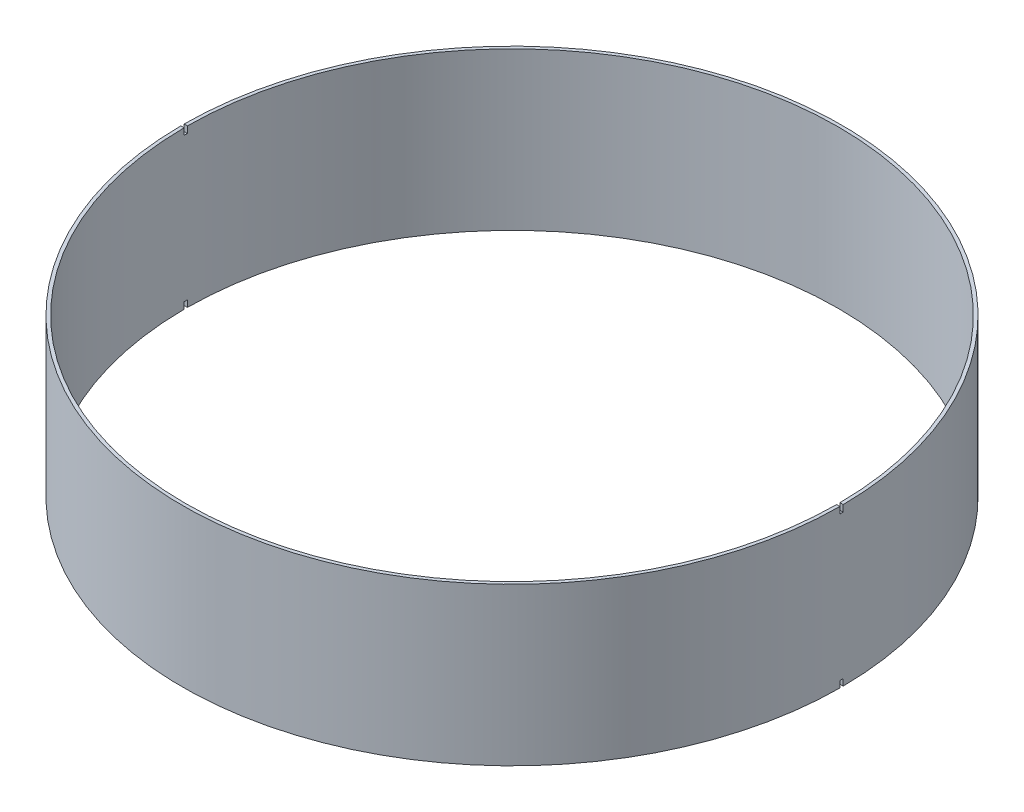
ISO-10303-21;
HEADER;
FILE_DESCRIPTION(('STEP AP214'),'2;1');
FILE_NAME('part.step','',(''),(''),'','','');
FILE_SCHEMA(('AUTOMOTIVE_DESIGN { 1 0 10303 214 1 1 1 1 }'));
ENDSEC;
DATA;
#1=APPLICATION_CONTEXT('core data for automotive mechanical design processes');
#2=APPLICATION_PROTOCOL_DEFINITION('international standard','automotive_design',2000,#1);
#3=PRODUCT_CONTEXT('',#1,'mechanical');
#4=PRODUCT('Part','Part','',(#3));
#5=PRODUCT_RELATED_PRODUCT_CATEGORY('part','',(#4));
#6=PRODUCT_DEFINITION_FORMATION('','',#4);
#7=PRODUCT_DEFINITION_CONTEXT('part definition',#1,'design');
#8=PRODUCT_DEFINITION('design','',#6,#7);
#9=PRODUCT_DEFINITION_SHAPE('','',#8);
#10=(LENGTH_UNIT() NAMED_UNIT(*) SI_UNIT(.MILLI.,.METRE.));
#11=(NAMED_UNIT(*) PLANE_ANGLE_UNIT() SI_UNIT($,.RADIAN.));
#12=(NAMED_UNIT(*) SI_UNIT($,.STERADIAN.) SOLID_ANGLE_UNIT());
#13=UNCERTAINTY_MEASURE_WITH_UNIT(LENGTH_MEASURE(1.E-05),#10,'distance_accuracy_value','');
#14=(GEOMETRIC_REPRESENTATION_CONTEXT(3) GLOBAL_UNCERTAINTY_ASSIGNED_CONTEXT((#13)) GLOBAL_UNIT_ASSIGNED_CONTEXT((#10,
#11,#12)) REPRESENTATION_CONTEXT('',''));
#15=CARTESIAN_POINT('',(0.,0.,0.));
#16=DIRECTION('',(0.,0.,1.));
#17=DIRECTION('',(1.,0.,0.));
#18=AXIS2_PLACEMENT_3D('',#15,#16,#17);
#19=CARTESIAN_POINT('',(0.,24.,0.));
#20=DIRECTION('',(0.,1.,0.));
#21=DIRECTION('',(0.,0.,1.));
#22=AXIS2_PLACEMENT_3D('',#19,#20,#21);
#23=PLANE('',#22);
#24=CARTESIAN_POINT('',(0.,24.,0.));
#25=DIRECTION('',(0.,1.,0.));
#26=DIRECTION('',(0.,0.,1.));
#27=AXIS2_PLACEMENT_3D('',#24,#25,#26);
#28=CIRCLE('',#27,50.3);
#29=CARTESIAN_POINT('',(-50.2993787237974,24.,0.25));
#30=VERTEX_POINT('',#29);
#31=CARTESIAN_POINT('',(50.2993787237974,24.,0.25));
#32=VERTEX_POINT('',#31);
#33=EDGE_CURVE('E177',#30,#32,#28,.T.);
#34=ORIENTED_EDGE('',*,*,#33,.T.);
#35=DIRECTION('',(-1.,0.,0.));
#36=VECTOR('',#35,1.);
#37=CARTESIAN_POINT('',(52.,24.,0.25));
#38=LINE('',#37,#36);
#39=CARTESIAN_POINT('',(49.7993724860063,24.,0.25));
#40=VERTEX_POINT('',#39);
#41=EDGE_CURVE('E234',#32,#40,#38,.T.);
#42=ORIENTED_EDGE('',*,*,#41,.T.);
#43=CARTESIAN_POINT('',(0.,24.,0.));
#44=DIRECTION('',(0.,1.,0.));
#45=DIRECTION('',(0.,0.,1.));
#46=AXIS2_PLACEMENT_3D('',#43,#44,#45);
#47=CIRCLE('',#46,49.8);
#48=CARTESIAN_POINT('',(-49.7993724860063,24.,0.25));
#49=VERTEX_POINT('',#48);
#50=EDGE_CURVE('E179',#49,#40,#47,.T.);
#51=ORIENTED_EDGE('',*,*,#50,.F.);
#52=EDGE_CURVE('E228',#49,#30,#38,.T.);
#53=ORIENTED_EDGE('',*,*,#52,.T.);
#54=EDGE_LOOP('',(#34,#42,#51,#53));
#55=FACE_BOUND('',#54,.T.);
#56=ADVANCED_FACE('F33',(#55),#23,.T.);
#57=CARTESIAN_POINT('',(50.2993787237974,24.,-0.25));
#58=VERTEX_POINT('',#57);
#59=CARTESIAN_POINT('',(-50.2993787237974,24.,-0.25));
#60=VERTEX_POINT('',#59);
#61=EDGE_CURVE('E188',#58,#60,#28,.T.);
#62=ORIENTED_EDGE('',*,*,#61,.T.);
#63=DIRECTION('',(-1.,0.,0.));
#64=VECTOR('',#63,1.);
#65=CARTESIAN_POINT('',(52.,24.,-0.25));
#66=LINE('',#65,#64);
#67=CARTESIAN_POINT('',(-49.7993724860063,24.,-0.25));
#68=VERTEX_POINT('',#67);
#69=EDGE_CURVE('E412',#68,#60,#66,.T.);
#70=ORIENTED_EDGE('',*,*,#69,.F.);
#71=CARTESIAN_POINT('',(49.7993724860063,24.,-0.25));
#72=VERTEX_POINT('',#71);
#73=EDGE_CURVE('E174',#72,#68,#47,.T.);
#74=ORIENTED_EDGE('',*,*,#73,.F.);
#75=EDGE_CURVE('E418',#58,#72,#66,.T.);
#76=ORIENTED_EDGE('',*,*,#75,.F.);
#77=EDGE_LOOP('',(#62,#70,#74,#76));
#78=FACE_BOUND('',#77,.T.);
#79=ADVANCED_FACE('F295',(#78),#23,.T.);
#80=CARTESIAN_POINT('',(0.,0.,0.));
#81=DIRECTION('',(0.,1.,0.));
#82=DIRECTION('',(0.,0.,1.));
#83=AXIS2_PLACEMENT_3D('',#80,#81,#82);
#84=PLANE('',#83);
#85=DIRECTION('',(-1.,0.,0.));
#86=VECTOR('',#85,1.);
#87=CARTESIAN_POINT('',(52.,0.,-0.25));
#88=LINE('',#87,#86);
#89=CARTESIAN_POINT('',(-49.7993724860063,0.,-0.25));
#90=VERTEX_POINT('',#89);
#91=CARTESIAN_POINT('',(-50.2993787237974,0.,-0.25));
#92=VERTEX_POINT('',#91);
#93=EDGE_CURVE('E241',#90,#92,#88,.T.);
#94=ORIENTED_EDGE('',*,*,#93,.T.);
#95=CARTESIAN_POINT('',(0.,0.,0.));
#96=DIRECTION('',(0.,1.,0.));
#97=DIRECTION('',(0.,0.,1.));
#98=AXIS2_PLACEMENT_3D('',#95,#96,#97);
#99=CIRCLE('',#98,50.3);
#100=CARTESIAN_POINT('',(50.2993787237974,0.,-0.25));
#101=VERTEX_POINT('',#100);
#102=EDGE_CURVE('E173',#101,#92,#99,.T.);
#103=ORIENTED_EDGE('',*,*,#102,.F.);
#104=CARTESIAN_POINT('',(49.7993724860063,0.,-0.25));
#105=VERTEX_POINT('',#104);
#106=EDGE_CURVE('E244',#101,#105,#88,.T.);
#107=ORIENTED_EDGE('',*,*,#106,.T.);
#108=CARTESIAN_POINT('',(0.,0.,0.));
#109=DIRECTION('',(0.,1.,0.));
#110=DIRECTION('',(0.,0.,1.));
#111=AXIS2_PLACEMENT_3D('',#108,#109,#110);
#112=CIRCLE('',#111,49.8);
#113=EDGE_CURVE('E261',#105,#90,#112,.T.);
#114=ORIENTED_EDGE('',*,*,#113,.T.);
#115=EDGE_LOOP('',(#94,#103,#107,#114));
#116=FACE_BOUND('',#115,.T.);
#117=ADVANCED_FACE('F266',(#116),#84,.F.);
#118=DIRECTION('',(-1.,0.,0.));
#119=VECTOR('',#118,1.);
#120=CARTESIAN_POINT('',(52.,0.,0.25));
#121=LINE('',#120,#119);
#122=CARTESIAN_POINT('',(50.2993787237974,0.,0.25));
#123=VERTEX_POINT('',#122);
#124=CARTESIAN_POINT('',(49.7993724860063,0.,0.25));
#125=VERTEX_POINT('',#124);
#126=EDGE_CURVE('E149',#123,#125,#121,.T.);
#127=ORIENTED_EDGE('',*,*,#126,.F.);
#128=CARTESIAN_POINT('',(-50.2993787237974,0.,0.25));
#129=VERTEX_POINT('',#128);
#130=EDGE_CURVE('E164',#129,#123,#99,.T.);
#131=ORIENTED_EDGE('',*,*,#130,.F.);
#132=CARTESIAN_POINT('',(-49.7993724860063,0.,0.25));
#133=VERTEX_POINT('',#132);
#134=EDGE_CURVE('E167',#133,#129,#121,.T.);
#135=ORIENTED_EDGE('',*,*,#134,.F.);
#136=EDGE_CURVE('E166',#133,#125,#112,.T.);
#137=ORIENTED_EDGE('',*,*,#136,.T.);
#138=EDGE_LOOP('',(#127,#131,#135,#137));
#139=FACE_BOUND('',#138,.T.);
#140=ADVANCED_FACE('F162',(#139),#84,.F.);
#141=CARTESIAN_POINT('',(0.,24.,0.));
#142=DIRECTION('',(0.,-1.,0.));
#143=DIRECTION('',(0.,0.,-1.));
#144=AXIS2_PLACEMENT_3D('',#141,#142,#143);
#145=CYLINDRICAL_SURFACE('',#144,50.3);
#146=DIRECTION('',(0.,-1.,0.));
#147=VECTOR('',#146,1.);
#148=CARTESIAN_POINT('',(50.2993787237974,24.,-0.25));
#149=LINE('',#148,#147);
#150=CARTESIAN_POINT('',(50.2993787237974,1.00000000000001,-0.25));
#151=VERTEX_POINT('',#150);
#152=EDGE_CURVE('E248',#101,#151,#149,.F.);
#153=ORIENTED_EDGE('',*,*,#152,.F.);
#154=ORIENTED_EDGE('',*,*,#102,.T.);
#155=DIRECTION('',(0.,-1.,0.));
#156=VECTOR('',#155,1.);
#157=CARTESIAN_POINT('',(-50.2993787237974,24.,-0.25));
#158=LINE('',#157,#156);
#159=CARTESIAN_POINT('',(-50.2993787237974,1.00000000000001,-0.25));
#160=VERTEX_POINT('',#159);
#161=EDGE_CURVE('E250',#160,#92,#158,.T.);
#162=ORIENTED_EDGE('',*,*,#161,.F.);
#163=CARTESIAN_POINT('',(0.,1.00000000000001,0.));
#164=DIRECTION('',(0.,-1.,0.));
#165=DIRECTION('',(0.,0.,-1.));
#166=AXIS2_PLACEMENT_3D('',#163,#164,#165);
#167=CIRCLE('',#166,50.3);
#168=CARTESIAN_POINT('',(-50.2993787237973,1.00000000000001,0.25));
#169=VERTEX_POINT('',#168);
#170=EDGE_CURVE('E156',#169,#160,#167,.T.);
#171=ORIENTED_EDGE('',*,*,#170,.F.);
#172=DIRECTION('',(0.,-1.,0.));
#173=VECTOR('',#172,1.);
#174=CARTESIAN_POINT('',(-50.2993787237974,24.,0.25));
#175=LINE('',#174,#173);
#176=EDGE_CURVE('E157',#129,#169,#175,.F.);
#177=ORIENTED_EDGE('',*,*,#176,.F.);
#178=ORIENTED_EDGE('',*,*,#130,.T.);
#179=DIRECTION('',(0.,-1.,0.));
#180=VECTOR('',#179,1.);
#181=CARTESIAN_POINT('',(50.2993787237974,24.,0.25));
#182=LINE('',#181,#180);
#183=CARTESIAN_POINT('',(50.2993787237974,1.00000000000001,0.25));
#184=VERTEX_POINT('',#183);
#185=EDGE_CURVE('E146',#184,#123,#182,.T.);
#186=ORIENTED_EDGE('',*,*,#185,.F.);
#187=EDGE_CURVE('E247',#151,#184,#167,.T.);
#188=ORIENTED_EDGE('',*,*,#187,.F.);
#189=EDGE_LOOP('',(#153,#154,#162,#171,#177,#178,#186,#188));
#190=FACE_BOUND('',#189,.T.);
#191=DIRECTION('',(0.,-1.,0.));
#192=VECTOR('',#191,1.);
#193=CARTESIAN_POINT('',(-50.2993787237974,24.,0.25));
#194=LINE('',#193,#192);
#195=CARTESIAN_POINT('',(-50.2993787237974,23.,0.25));
#196=VERTEX_POINT('',#195);
#197=EDGE_CURVE('E258',#196,#30,#194,.F.);
#198=ORIENTED_EDGE('',*,*,#197,.F.);
#199=CARTESIAN_POINT('',(0.,23.,0.));
#200=DIRECTION('',(0.,1.,0.));
#201=DIRECTION('',(0.,0.,1.));
#202=AXIS2_PLACEMENT_3D('',#199,#200,#201);
#203=CIRCLE('',#202,50.3);
#204=CARTESIAN_POINT('',(-50.2993787237973,23.,-0.25));
#205=VERTEX_POINT('',#204);
#206=EDGE_CURVE('E221',#205,#196,#203,.T.);
#207=ORIENTED_EDGE('',*,*,#206,.F.);
#208=DIRECTION('',(0.,-1.,0.));
#209=VECTOR('',#208,1.);
#210=CARTESIAN_POINT('',(-50.2993787237974,24.,-0.25));
#211=LINE('',#210,#209);
#212=EDGE_CURVE('E254',#60,#205,#211,.T.);
#213=ORIENTED_EDGE('',*,*,#212,.F.);
#214=ORIENTED_EDGE('',*,*,#61,.F.);
#215=DIRECTION('',(0.,-1.,0.));
#216=VECTOR('',#215,1.);
#217=CARTESIAN_POINT('',(50.2993787237974,24.,-0.25));
#218=LINE('',#217,#216);
#219=CARTESIAN_POINT('',(50.2993787237974,23.,-0.25));
#220=VERTEX_POINT('',#219);
#221=EDGE_CURVE('E252',#220,#58,#218,.F.);
#222=ORIENTED_EDGE('',*,*,#221,.F.);
#223=CARTESIAN_POINT('',(50.2993787237974,23.,0.25));
#224=VERTEX_POINT('',#223);
#225=EDGE_CURVE('E257',#224,#220,#203,.T.);
#226=ORIENTED_EDGE('',*,*,#225,.F.);
#227=DIRECTION('',(0.,-1.,0.));
#228=VECTOR('',#227,1.);
#229=CARTESIAN_POINT('',(50.2993787237974,24.,0.25));
#230=LINE('',#229,#228);
#231=EDGE_CURVE('E260',#32,#224,#230,.T.);
#232=ORIENTED_EDGE('',*,*,#231,.F.);
#233=ORIENTED_EDGE('',*,*,#33,.F.);
#234=EDGE_LOOP('',(#198,#207,#213,#214,#222,#226,#232,#233));
#235=FACE_BOUND('',#234,.T.);
#236=ADVANCED_FACE('F35',(#190,#235),#145,.T.);
#237=CARTESIAN_POINT('',(0.,24.,0.));
#238=DIRECTION('',(0.,-1.,0.));
#239=DIRECTION('',(0.,0.,-1.));
#240=AXIS2_PLACEMENT_3D('',#237,#238,#239);
#241=CYLINDRICAL_SURFACE('',#240,49.8);
#242=ORIENTED_EDGE('',*,*,#113,.F.);
#243=DIRECTION('',(0.,-1.,0.));
#244=VECTOR('',#243,1.);
#245=CARTESIAN_POINT('',(49.7993724860063,24.,-0.25));
#246=LINE('',#245,#244);
#247=CARTESIAN_POINT('',(49.7993724860063,1.00000000000001,-0.25));
#248=VERTEX_POINT('',#247);
#249=EDGE_CURVE('E197',#105,#248,#246,.F.);
#250=ORIENTED_EDGE('',*,*,#249,.T.);
#251=CARTESIAN_POINT('',(0.,1.00000000000001,0.));
#252=DIRECTION('',(0.,-1.,0.));
#253=DIRECTION('',(0.,0.,-1.));
#254=AXIS2_PLACEMENT_3D('',#251,#252,#253);
#255=CIRCLE('',#254,49.8);
#256=CARTESIAN_POINT('',(49.7993724860063,1.00000000000001,0.25));
#257=VERTEX_POINT('',#256);
#258=EDGE_CURVE('E192',#248,#257,#255,.T.);
#259=ORIENTED_EDGE('',*,*,#258,.T.);
#260=DIRECTION('',(0.,-1.,0.));
#261=VECTOR('',#260,1.);
#262=CARTESIAN_POINT('',(49.7993724860063,24.,0.25));
#263=LINE('',#262,#261);
#264=EDGE_CURVE('E195',#257,#125,#263,.T.);
#265=ORIENTED_EDGE('',*,*,#264,.T.);
#266=ORIENTED_EDGE('',*,*,#136,.F.);
#267=DIRECTION('',(0.,-1.,0.));
#268=VECTOR('',#267,1.);
#269=CARTESIAN_POINT('',(-49.7993724860063,24.,0.25));
#270=LINE('',#269,#268);
#271=CARTESIAN_POINT('',(-49.7993724860063,1.00000000000001,0.25));
#272=VERTEX_POINT('',#271);
#273=EDGE_CURVE('E184',#133,#272,#270,.F.);
#274=ORIENTED_EDGE('',*,*,#273,.T.);
#275=CARTESIAN_POINT('',(-49.7993724860063,1.00000000000001,-0.25));
#276=VERTEX_POINT('',#275);
#277=EDGE_CURVE('E187',#272,#276,#255,.T.);
#278=ORIENTED_EDGE('',*,*,#277,.T.);
#279=DIRECTION('',(0.,-1.,0.));
#280=VECTOR('',#279,1.);
#281=CARTESIAN_POINT('',(-49.7993724860063,24.,-0.25));
#282=LINE('',#281,#280);
#283=EDGE_CURVE('E191',#276,#90,#282,.T.);
#284=ORIENTED_EDGE('',*,*,#283,.T.);
#285=EDGE_LOOP('',(#242,#250,#259,#265,#266,#274,#278,#284));
#286=FACE_BOUND('',#285,.T.);
#287=CARTESIAN_POINT('',(0.,23.,0.));
#288=DIRECTION('',(0.,1.,0.));
#289=DIRECTION('',(0.,0.,1.));
#290=AXIS2_PLACEMENT_3D('',#287,#288,#289);
#291=CIRCLE('',#290,49.8);
#292=CARTESIAN_POINT('',(-49.7993724860063,23.,-0.25));
#293=VERTEX_POINT('',#292);
#294=CARTESIAN_POINT('',(-49.7993724860063,23.,0.25));
#295=VERTEX_POINT('',#294);
#296=EDGE_CURVE('E41',#293,#295,#291,.T.);
#297=ORIENTED_EDGE('',*,*,#296,.T.);
#298=DIRECTION('',(0.,-1.,0.));
#299=VECTOR('',#298,1.);
#300=CARTESIAN_POINT('',(-49.7993724860063,24.,0.25));
#301=LINE('',#300,#299);
#302=EDGE_CURVE('E11',#295,#49,#301,.F.);
#303=ORIENTED_EDGE('',*,*,#302,.T.);
#304=ORIENTED_EDGE('',*,*,#50,.T.);
#305=DIRECTION('',(0.,-1.,0.));
#306=VECTOR('',#305,1.);
#307=CARTESIAN_POINT('',(49.7993724860063,24.,0.25));
#308=LINE('',#307,#306);
#309=CARTESIAN_POINT('',(49.7993724860063,23.,0.25));
#310=VERTEX_POINT('',#309);
#311=EDGE_CURVE('E206',#40,#310,#308,.T.);
#312=ORIENTED_EDGE('',*,*,#311,.T.);
#313=CARTESIAN_POINT('',(49.7993724860063,23.,-0.25));
#314=VERTEX_POINT('',#313);
#315=EDGE_CURVE('E203',#310,#314,#291,.T.);
#316=ORIENTED_EDGE('',*,*,#315,.T.);
#317=DIRECTION('',(0.,-1.,0.));
#318=VECTOR('',#317,1.);
#319=CARTESIAN_POINT('',(49.7993724860063,24.,-0.25));
#320=LINE('',#319,#318);
#321=EDGE_CURVE('E200',#314,#72,#320,.F.);
#322=ORIENTED_EDGE('',*,*,#321,.T.);
#323=ORIENTED_EDGE('',*,*,#73,.T.);
#324=DIRECTION('',(0.,-1.,0.));
#325=VECTOR('',#324,1.);
#326=CARTESIAN_POINT('',(-49.7993724860063,24.,-0.25));
#327=LINE('',#326,#325);
#328=EDGE_CURVE('E208',#68,#293,#327,.T.);
#329=ORIENTED_EDGE('',*,*,#328,.T.);
#330=EDGE_LOOP('',(#297,#303,#304,#312,#316,#322,#323,#329));
#331=FACE_BOUND('',#330,.T.);
#332=ADVANCED_FACE('F212',(#286,#331),#241,.F.);
#333=CARTESIAN_POINT('',(52.,0.,0.25));
#334=DIRECTION('',(0.,0.,-1.));
#335=DIRECTION('',(-1.,0.,0.));
#336=AXIS2_PLACEMENT_3D('',#333,#334,#335);
#337=PLANE('',#336);
#338=ORIENTED_EDGE('',*,*,#176,.T.);
#339=DIRECTION('',(-1.,0.,0.));
#340=VECTOR('',#339,1.);
#341=CARTESIAN_POINT('',(52.,1.00000000000001,0.25));
#342=LINE('',#341,#340);
#343=EDGE_CURVE('E56',#272,#169,#342,.T.);
#344=ORIENTED_EDGE('',*,*,#343,.F.);
#345=ORIENTED_EDGE('',*,*,#273,.F.);
#346=ORIENTED_EDGE('',*,*,#134,.T.);
#347=EDGE_LOOP('',(#338,#344,#345,#346));
#348=FACE_BOUND('',#347,.T.);
#349=ADVANCED_FACE('F282',(#348),#337,.T.);
#350=CARTESIAN_POINT('',(52.,1.00000000000001,0.25));
#351=DIRECTION('',(0.,-1.,0.));
#352=DIRECTION('',(0.,0.,-1.));
#353=AXIS2_PLACEMENT_3D('',#350,#351,#352);
#354=PLANE('',#353);
#355=ORIENTED_EDGE('',*,*,#170,.T.);
#356=DIRECTION('',(-1.,0.,0.));
#357=VECTOR('',#356,1.);
#358=CARTESIAN_POINT('',(52.,1.00000000000001,-0.25));
#359=LINE('',#358,#357);
#360=EDGE_CURVE('E237',#276,#160,#359,.T.);
#361=ORIENTED_EDGE('',*,*,#360,.F.);
#362=ORIENTED_EDGE('',*,*,#277,.F.);
#363=ORIENTED_EDGE('',*,*,#343,.T.);
#364=EDGE_LOOP('',(#355,#361,#362,#363));
#365=FACE_BOUND('',#364,.T.);
#366=ADVANCED_FACE('F275',(#365),#354,.T.);
#367=CARTESIAN_POINT('',(52.,1.00000000000001,-0.25));
#368=DIRECTION('',(0.,0.,1.));
#369=DIRECTION('',(1.,0.,0.));
#370=AXIS2_PLACEMENT_3D('',#367,#368,#369);
#371=PLANE('',#370);
#372=ORIENTED_EDGE('',*,*,#161,.T.);
#373=ORIENTED_EDGE('',*,*,#93,.F.);
#374=ORIENTED_EDGE('',*,*,#283,.F.);
#375=ORIENTED_EDGE('',*,*,#360,.T.);
#376=EDGE_LOOP('',(#372,#373,#374,#375));
#377=FACE_BOUND('',#376,.T.);
#378=ADVANCED_FACE('F272',(#377),#371,.T.);
#379=ORIENTED_EDGE('',*,*,#152,.T.);
#380=EDGE_CURVE('E240',#151,#248,#359,.T.);
#381=ORIENTED_EDGE('',*,*,#380,.T.);
#382=ORIENTED_EDGE('',*,*,#249,.F.);
#383=ORIENTED_EDGE('',*,*,#106,.F.);
#384=EDGE_LOOP('',(#379,#381,#382,#383));
#385=FACE_BOUND('',#384,.T.);
#386=ADVANCED_FACE('F279',(#385),#371,.T.);
#387=ORIENTED_EDGE('',*,*,#187,.T.);
#388=EDGE_CURVE('E152',#184,#257,#342,.T.);
#389=ORIENTED_EDGE('',*,*,#388,.T.);
#390=ORIENTED_EDGE('',*,*,#258,.F.);
#391=ORIENTED_EDGE('',*,*,#380,.F.);
#392=EDGE_LOOP('',(#387,#389,#390,#391));
#393=FACE_BOUND('',#392,.T.);
#394=ADVANCED_FACE('F281',(#393),#354,.T.);
#395=ORIENTED_EDGE('',*,*,#185,.T.);
#396=ORIENTED_EDGE('',*,*,#126,.T.);
#397=ORIENTED_EDGE('',*,*,#264,.F.);
#398=ORIENTED_EDGE('',*,*,#388,.F.);
#399=EDGE_LOOP('',(#395,#396,#397,#398));
#400=FACE_BOUND('',#399,.T.);
#401=ADVANCED_FACE('F148',(#400),#337,.T.);
#402=CARTESIAN_POINT('',(52.,23.,-0.25));
#403=DIRECTION('',(0.,0.,1.));
#404=DIRECTION('',(1.,0.,0.));
#405=AXIS2_PLACEMENT_3D('',#402,#403,#404);
#406=PLANE('',#405);
#407=ORIENTED_EDGE('',*,*,#221,.T.);
#408=ORIENTED_EDGE('',*,*,#75,.T.);
#409=ORIENTED_EDGE('',*,*,#321,.F.);
#410=DIRECTION('',(-1.,0.,0.));
#411=VECTOR('',#410,1.);
#412=CARTESIAN_POINT('',(52.,23.,-0.25));
#413=LINE('',#412,#411);
#414=EDGE_CURVE('E225',#220,#314,#413,.T.);
#415=ORIENTED_EDGE('',*,*,#414,.F.);
#416=EDGE_LOOP('',(#407,#408,#409,#415));
#417=FACE_BOUND('',#416,.T.);
#418=ADVANCED_FACE('F293',(#417),#406,.T.);
#419=CARTESIAN_POINT('',(52.,23.,0.25));
#420=DIRECTION('',(0.,1.,0.));
#421=DIRECTION('',(0.,0.,1.));
#422=AXIS2_PLACEMENT_3D('',#419,#420,#421);
#423=PLANE('',#422);
#424=ORIENTED_EDGE('',*,*,#225,.T.);
#425=ORIENTED_EDGE('',*,*,#414,.T.);
#426=ORIENTED_EDGE('',*,*,#315,.F.);
#427=DIRECTION('',(-1.,0.,0.));
#428=VECTOR('',#427,1.);
#429=CARTESIAN_POINT('',(52.,23.,0.25));
#430=LINE('',#429,#428);
#431=EDGE_CURVE('E224',#224,#310,#430,.T.);
#432=ORIENTED_EDGE('',*,*,#431,.F.);
#433=EDGE_LOOP('',(#424,#425,#426,#432));
#434=FACE_BOUND('',#433,.T.);
#435=ADVANCED_FACE('F364',(#434),#423,.T.);
#436=CARTESIAN_POINT('',(52.,24.,0.25));
#437=DIRECTION('',(0.,0.,-1.));
#438=DIRECTION('',(-1.,0.,0.));
#439=AXIS2_PLACEMENT_3D('',#436,#437,#438);
#440=PLANE('',#439);
#441=ORIENTED_EDGE('',*,*,#231,.T.);
#442=ORIENTED_EDGE('',*,*,#431,.T.);
#443=ORIENTED_EDGE('',*,*,#311,.F.);
#444=ORIENTED_EDGE('',*,*,#41,.F.);
#445=EDGE_LOOP('',(#441,#442,#443,#444));
#446=FACE_BOUND('',#445,.T.);
#447=ADVANCED_FACE('F375',(#446),#440,.T.);
#448=ORIENTED_EDGE('',*,*,#197,.T.);
#449=ORIENTED_EDGE('',*,*,#52,.F.);
#450=ORIENTED_EDGE('',*,*,#302,.F.);
#451=EDGE_CURVE('E220',#295,#196,#430,.T.);
#452=ORIENTED_EDGE('',*,*,#451,.T.);
#453=EDGE_LOOP('',(#448,#449,#450,#452));
#454=FACE_BOUND('',#453,.T.);
#455=ADVANCED_FACE('F385',(#454),#440,.T.);
#456=ORIENTED_EDGE('',*,*,#206,.T.);
#457=ORIENTED_EDGE('',*,*,#451,.F.);
#458=ORIENTED_EDGE('',*,*,#296,.F.);
#459=EDGE_CURVE('E48',#293,#205,#413,.T.);
#460=ORIENTED_EDGE('',*,*,#459,.T.);
#461=EDGE_LOOP('',(#456,#457,#458,#460));
#462=FACE_BOUND('',#461,.T.);
#463=ADVANCED_FACE('F217',(#462),#423,.T.);
#464=ORIENTED_EDGE('',*,*,#212,.T.);
#465=ORIENTED_EDGE('',*,*,#459,.F.);
#466=ORIENTED_EDGE('',*,*,#328,.F.);
#467=ORIENTED_EDGE('',*,*,#69,.T.);
#468=EDGE_LOOP('',(#464,#465,#466,#467));
#469=FACE_BOUND('',#468,.T.);
#470=ADVANCED_FACE('F367',(#469),#406,.T.);
#471=CLOSED_SHELL('',(#56,#79,#117,#140,#236,#332,#349,#366,#378,#386,#394,#401,#418,#435,#447,
#455,#463,#470));
#472=MANIFOLD_SOLID_BREP('B2',#471);
#473=ADVANCED_BREP_SHAPE_REPRESENTATION('',(#18,#472),#14);
#474=SHAPE_DEFINITION_REPRESENTATION(#9,#473);
ENDSEC;
END-ISO-10303-21;
